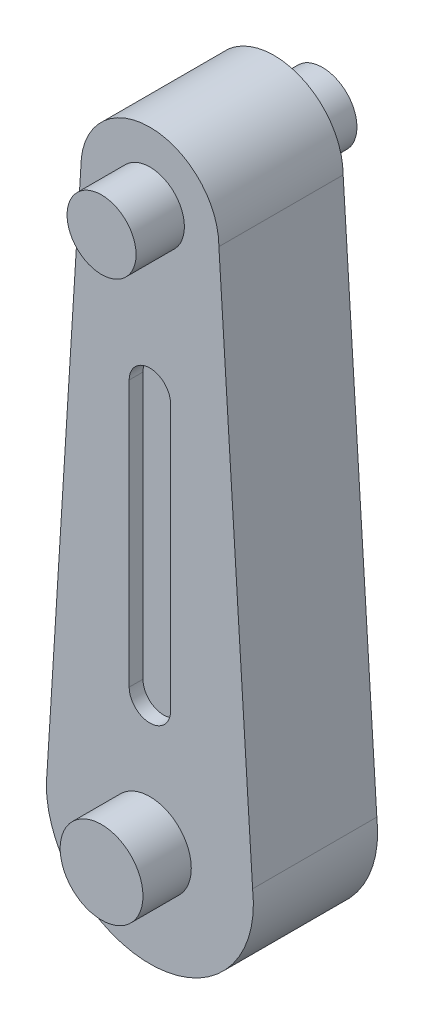
ISO-10303-21;
HEADER;
FILE_DESCRIPTION(('STEP AP214'),'2;1');
FILE_NAME('part.step','',(''),(''),'','','');
FILE_SCHEMA(('AUTOMOTIVE_DESIGN { 1 0 10303 214 1 1 1 1 }'));
ENDSEC;
DATA;
#1=APPLICATION_CONTEXT('core data for automotive mechanical design processes');
#2=APPLICATION_PROTOCOL_DEFINITION('international standard','automotive_design',2000,#1);
#3=PRODUCT_CONTEXT('',#1,'mechanical');
#4=PRODUCT('Part','Part','',(#3));
#5=PRODUCT_RELATED_PRODUCT_CATEGORY('part','',(#4));
#6=PRODUCT_DEFINITION_FORMATION('','',#4);
#7=PRODUCT_DEFINITION_CONTEXT('part definition',#1,'design');
#8=PRODUCT_DEFINITION('design','',#6,#7);
#9=PRODUCT_DEFINITION_SHAPE('','',#8);
#10=(LENGTH_UNIT() NAMED_UNIT(*) SI_UNIT(.MILLI.,.METRE.));
#11=(NAMED_UNIT(*) PLANE_ANGLE_UNIT() SI_UNIT($,.RADIAN.));
#12=(NAMED_UNIT(*) SI_UNIT($,.STERADIAN.) SOLID_ANGLE_UNIT());
#13=UNCERTAINTY_MEASURE_WITH_UNIT(LENGTH_MEASURE(1.E-05),#10,'distance_accuracy_value','');
#14=(GEOMETRIC_REPRESENTATION_CONTEXT(3) GLOBAL_UNCERTAINTY_ASSIGNED_CONTEXT((#13)) GLOBAL_UNIT_ASSIGNED_CONTEXT((#10,
#11,#12)) REPRESENTATION_CONTEXT('',''));
#15=CARTESIAN_POINT('',(0.,0.,0.));
#16=DIRECTION('',(0.,0.,1.));
#17=DIRECTION('',(1.,0.,0.));
#18=AXIS2_PLACEMENT_3D('',#15,#16,#17);
#19=CARTESIAN_POINT('',(0.,-187.5,-45.));
#20=DIRECTION('',(0.,0.,1.));
#21=DIRECTION('',(1.,0.,0.));
#22=AXIS2_PLACEMENT_3D('',#19,#20,#21);
#23=PLANE('',#22);
#24=CARTESIAN_POINT('',(0.,-187.5,-45.));
#25=DIRECTION('',(0.,0.,1.));
#26=DIRECTION('',(1.,0.,0.));
#27=AXIS2_PLACEMENT_3D('',#24,#25,#26);
#28=CIRCLE('',#27,75.);
#29=CARTESIAN_POINT('',(-74.4163424124514,-178.161478599222,-45.));
#30=VERTEX_POINT('',#29);
#31=CARTESIAN_POINT('',(74.4163424124514,-178.161478599222,-45.));
#32=VERTEX_POINT('',#31);
#33=EDGE_CURVE('E254',#30,#32,#28,.T.);
#34=ORIENTED_EDGE('',*,*,#33,.F.);
#35=DIRECTION('',(-0.0623782861551805,-0.998052578482888,0.));
#36=VECTOR('',#35,1.);
#37=CARTESIAN_POINT('',(-50.,212.5,-45.));
#38=LINE('',#37,#36);
#39=CARTESIAN_POINT('',(-50.,212.5,-45.));
#40=VERTEX_POINT('',#39);
#41=EDGE_CURVE('E263',#40,#30,#38,.T.);
#42=ORIENTED_EDGE('',*,*,#41,.F.);
#43=CARTESIAN_POINT('',(0.,212.5,-45.));
#44=DIRECTION('',(0.,0.,1.));
#45=DIRECTION('',(1.,0.,0.));
#46=AXIS2_PLACEMENT_3D('',#43,#44,#45);
#47=CIRCLE('',#46,50.);
#48=CARTESIAN_POINT('',(50.,212.5,-45.));
#49=VERTEX_POINT('',#48);
#50=EDGE_CURVE('E279',#49,#40,#47,.T.);
#51=ORIENTED_EDGE('',*,*,#50,.F.);
#52=DIRECTION('',(-0.0623782861551805,0.998052578482888,0.));
#53=VECTOR('',#52,1.);
#54=CARTESIAN_POINT('',(50.,212.5,-45.));
#55=LINE('',#54,#53);
#56=EDGE_CURVE('E276',#32,#49,#55,.T.);
#57=ORIENTED_EDGE('',*,*,#56,.F.);
#58=EDGE_LOOP('',(#34,#42,#51,#57));
#59=FACE_BOUND('',#58,.T.);
#60=CARTESIAN_POINT('',(0.,212.5,-45.));
#61=DIRECTION('',(0.,0.,1.));
#62=DIRECTION('',(1.,0.,0.));
#63=AXIS2_PLACEMENT_3D('',#60,#61,#62);
#64=CIRCLE('',#63,25.);
#65=CARTESIAN_POINT('',(25.,212.5,-45.));
#66=VERTEX_POINT('',#65);
#67=EDGE_CURVE('E230',#66,#66,#64,.T.);
#68=ORIENTED_EDGE('',*,*,#67,.T.);
#69=EDGE_LOOP('',(#68));
#70=FACE_BOUND('',#69,.T.);
#71=CARTESIAN_POINT('',(0.,-187.5,-45.));
#72=DIRECTION('',(0.,0.,1.));
#73=DIRECTION('',(1.,0.,0.));
#74=AXIS2_PLACEMENT_3D('',#71,#72,#73);
#75=CIRCLE('',#74,30.);
#76=CARTESIAN_POINT('',(30.,-187.5,-45.));
#77=VERTEX_POINT('',#76);
#78=EDGE_CURVE('E217',#77,#77,#75,.T.);
#79=ORIENTED_EDGE('',*,*,#78,.T.);
#80=EDGE_LOOP('',(#79));
#81=FACE_BOUND('',#80,.T.);
#82=CARTESIAN_POINT('',(0.,96.3528283139753,-45.));
#83=DIRECTION('',(0.,0.,1.));
#84=DIRECTION('',(1.,0.,0.));
#85=AXIS2_PLACEMENT_3D('',#82,#83,#84);
#86=CIRCLE('',#85,15.);
#87=CARTESIAN_POINT('',(14.9999999999999,96.3528283139753,-45.));
#88=VERTEX_POINT('',#87);
#89=CARTESIAN_POINT('',(-15.,96.3528283139753,-45.));
#90=VERTEX_POINT('',#89);
#91=EDGE_CURVE('E59',#88,#90,#86,.T.);
#92=ORIENTED_EDGE('',*,*,#91,.T.);
#93=DIRECTION('',(0.,-1.,0.));
#94=VECTOR('',#93,1.);
#95=CARTESIAN_POINT('',(-15.,96.3528283139753,-45.));
#96=LINE('',#95,#94);
#97=CARTESIAN_POINT('',(-15.,-96.3528283139753,-45.));
#98=VERTEX_POINT('',#97);
#99=EDGE_CURVE('E156',#90,#98,#96,.T.);
#100=ORIENTED_EDGE('',*,*,#99,.T.);
#101=CARTESIAN_POINT('',(0.,-96.3528283139753,-45.));
#102=DIRECTION('',(0.,0.,1.));
#103=DIRECTION('',(1.,0.,0.));
#104=AXIS2_PLACEMENT_3D('',#101,#102,#103);
#105=CIRCLE('',#104,15.);
#106=CARTESIAN_POINT('',(15.,-96.3528283139753,-45.));
#107=VERTEX_POINT('',#106);
#108=EDGE_CURVE('E160',#98,#107,#105,.T.);
#109=ORIENTED_EDGE('',*,*,#108,.T.);
#110=DIRECTION('',(0.,1.,0.));
#111=VECTOR('',#110,1.);
#112=CARTESIAN_POINT('',(14.9999999999999,96.3528283139753,-45.));
#113=LINE('',#112,#111);
#114=EDGE_CURVE('E169',#107,#88,#113,.T.);
#115=ORIENTED_EDGE('',*,*,#114,.T.);
#116=EDGE_LOOP('',(#92,#100,#109,#115));
#117=FACE_BOUND('',#116,.T.);
#118=ADVANCED_FACE('F43',(#59,#70,#81,#117),#23,.F.);
#119=CARTESIAN_POINT('',(0.,-187.5,45.));
#120=DIRECTION('',(0.,0.,-1.));
#121=DIRECTION('',(-1.,0.,0.));
#122=AXIS2_PLACEMENT_3D('',#119,#120,#121);
#123=CYLINDRICAL_SURFACE('',#122,75.);
#124=ORIENTED_EDGE('',*,*,#33,.T.);
#125=DIRECTION('',(0.,0.,-1.));
#126=VECTOR('',#125,1.);
#127=CARTESIAN_POINT('',(74.4163424124514,-178.161478599222,45.));
#128=LINE('',#127,#126);
#129=CARTESIAN_POINT('',(74.4163424124514,-178.161478599222,45.));
#130=VERTEX_POINT('',#129);
#131=EDGE_CURVE('E11',#130,#32,#128,.T.);
#132=ORIENTED_EDGE('',*,*,#131,.F.);
#133=CARTESIAN_POINT('',(0.,-187.5,45.));
#134=DIRECTION('',(0.,0.,1.));
#135=DIRECTION('',(1.,0.,0.));
#136=AXIS2_PLACEMENT_3D('',#133,#134,#135);
#137=CIRCLE('',#136,75.);
#138=CARTESIAN_POINT('',(-74.4163424124514,-178.161478599222,45.));
#139=VERTEX_POINT('',#138);
#140=EDGE_CURVE('E258',#139,#130,#137,.T.);
#141=ORIENTED_EDGE('',*,*,#140,.F.);
#142=DIRECTION('',(0.,0.,-1.));
#143=VECTOR('',#142,1.);
#144=CARTESIAN_POINT('',(-74.4163424124514,-178.161478599222,45.));
#145=LINE('',#144,#143);
#146=EDGE_CURVE('E272',#139,#30,#145,.T.);
#147=ORIENTED_EDGE('',*,*,#146,.T.);
#148=EDGE_LOOP('',(#124,#132,#141,#147));
#149=FACE_BOUND('',#148,.T.);
#150=ADVANCED_FACE('F45',(#149),#123,.T.);
#151=CARTESIAN_POINT('',(50.,212.5,45.));
#152=DIRECTION('',(-0.998052578482888,-0.0623782861551805,0.));
#153=DIRECTION('',(0.0623782861551805,-0.998052578482889,0.));
#154=AXIS2_PLACEMENT_3D('',#151,#152,#153);
#155=PLANE('',#154);
#156=ORIENTED_EDGE('',*,*,#56,.T.);
#157=DIRECTION('',(0.,0.,-1.));
#158=VECTOR('',#157,1.);
#159=CARTESIAN_POINT('',(50.,212.5,45.));
#160=LINE('',#159,#158);
#161=CARTESIAN_POINT('',(50.,212.5,45.));
#162=VERTEX_POINT('',#161);
#163=EDGE_CURVE('E52',#162,#49,#160,.T.);
#164=ORIENTED_EDGE('',*,*,#163,.F.);
#165=DIRECTION('',(-0.0623782861551805,0.998052578482888,0.));
#166=VECTOR('',#165,1.);
#167=CARTESIAN_POINT('',(50.,212.5,45.));
#168=LINE('',#167,#166);
#169=EDGE_CURVE('E262',#130,#162,#168,.T.);
#170=ORIENTED_EDGE('',*,*,#169,.F.);
#171=ORIENTED_EDGE('',*,*,#131,.T.);
#172=EDGE_LOOP('',(#156,#164,#170,#171));
#173=FACE_BOUND('',#172,.T.);
#174=ADVANCED_FACE('F312',(#173),#155,.F.);
#175=CARTESIAN_POINT('',(0.,212.5,45.));
#176=DIRECTION('',(0.,0.,-1.));
#177=DIRECTION('',(-1.,0.,0.));
#178=AXIS2_PLACEMENT_3D('',#175,#176,#177);
#179=CYLINDRICAL_SURFACE('',#178,50.);
#180=ORIENTED_EDGE('',*,*,#50,.T.);
#181=DIRECTION('',(0.,0.,-1.));
#182=VECTOR('',#181,1.);
#183=CARTESIAN_POINT('',(-50.,212.5,45.));
#184=LINE('',#183,#182);
#185=CARTESIAN_POINT('',(-50.,212.5,45.));
#186=VERTEX_POINT('',#185);
#187=EDGE_CURVE('E287',#186,#40,#184,.T.);
#188=ORIENTED_EDGE('',*,*,#187,.F.);
#189=CARTESIAN_POINT('',(0.,212.5,45.));
#190=DIRECTION('',(0.,0.,1.));
#191=DIRECTION('',(1.,0.,0.));
#192=AXIS2_PLACEMENT_3D('',#189,#190,#191);
#193=CIRCLE('',#192,50.);
#194=EDGE_CURVE('E266',#162,#186,#193,.T.);
#195=ORIENTED_EDGE('',*,*,#194,.F.);
#196=ORIENTED_EDGE('',*,*,#163,.T.);
#197=EDGE_LOOP('',(#180,#188,#195,#196));
#198=FACE_BOUND('',#197,.T.);
#199=ADVANCED_FACE('F296',(#198),#179,.T.);
#200=CARTESIAN_POINT('',(-50.,212.5,45.));
#201=DIRECTION('',(0.998052578482888,-0.0623782861551805,0.));
#202=DIRECTION('',(0.0623782861551805,0.998052578482889,0.));
#203=AXIS2_PLACEMENT_3D('',#200,#201,#202);
#204=PLANE('',#203);
#205=ORIENTED_EDGE('',*,*,#41,.T.);
#206=ORIENTED_EDGE('',*,*,#146,.F.);
#207=DIRECTION('',(-0.0623782861551805,-0.998052578482888,0.));
#208=VECTOR('',#207,1.);
#209=CARTESIAN_POINT('',(-50.,212.5,45.));
#210=LINE('',#209,#208);
#211=EDGE_CURVE('E269',#186,#139,#210,.T.);
#212=ORIENTED_EDGE('',*,*,#211,.F.);
#213=ORIENTED_EDGE('',*,*,#187,.T.);
#214=EDGE_LOOP('',(#205,#206,#212,#213));
#215=FACE_BOUND('',#214,.T.);
#216=ADVANCED_FACE('F305',(#215),#204,.F.);
#217=CARTESIAN_POINT('',(0.,-187.5,45.));
#218=DIRECTION('',(0.,0.,1.));
#219=DIRECTION('',(1.,0.,0.));
#220=AXIS2_PLACEMENT_3D('',#217,#218,#219);
#221=PLANE('',#220);
#222=CARTESIAN_POINT('',(0.,96.3528283139753,45.));
#223=DIRECTION('',(0.,0.,1.));
#224=DIRECTION('',(1.,0.,0.));
#225=AXIS2_PLACEMENT_3D('',#222,#223,#224);
#226=CIRCLE('',#225,15.);
#227=CARTESIAN_POINT('',(14.9999999999999,96.3528283139753,45.));
#228=VERTEX_POINT('',#227);
#229=CARTESIAN_POINT('',(-15.,96.3528283139753,45.));
#230=VERTEX_POINT('',#229);
#231=EDGE_CURVE('E67',#228,#230,#226,.T.);
#232=ORIENTED_EDGE('',*,*,#231,.F.);
#233=DIRECTION('',(0.,1.,0.));
#234=VECTOR('',#233,1.);
#235=CARTESIAN_POINT('',(14.9999999999999,96.3528283139753,45.));
#236=LINE('',#235,#234);
#237=CARTESIAN_POINT('',(15.,-96.3528283139753,45.));
#238=VERTEX_POINT('',#237);
#239=EDGE_CURVE('E188',#238,#228,#236,.T.);
#240=ORIENTED_EDGE('',*,*,#239,.F.);
#241=CARTESIAN_POINT('',(0.,-96.3528283139753,45.));
#242=DIRECTION('',(0.,0.,1.));
#243=DIRECTION('',(1.,0.,0.));
#244=AXIS2_PLACEMENT_3D('',#241,#242,#243);
#245=CIRCLE('',#244,15.);
#246=CARTESIAN_POINT('',(-15.,-96.3528283139753,45.));
#247=VERTEX_POINT('',#246);
#248=EDGE_CURVE('E207',#247,#238,#245,.T.);
#249=ORIENTED_EDGE('',*,*,#248,.F.);
#250=DIRECTION('',(0.,-1.,0.));
#251=VECTOR('',#250,1.);
#252=CARTESIAN_POINT('',(-15.,96.3528283139753,45.));
#253=LINE('',#252,#251);
#254=EDGE_CURVE('E203',#230,#247,#253,.T.);
#255=ORIENTED_EDGE('',*,*,#254,.F.);
#256=EDGE_LOOP('',(#232,#240,#249,#255));
#257=FACE_BOUND('',#256,.T.);
#258=CARTESIAN_POINT('',(0.,-187.5,45.));
#259=DIRECTION('',(0.,0.,1.));
#260=DIRECTION('',(1.,0.,0.));
#261=AXIS2_PLACEMENT_3D('',#258,#259,#260);
#262=CIRCLE('',#261,30.);
#263=CARTESIAN_POINT('',(30.,-187.5,45.));
#264=VERTEX_POINT('',#263);
#265=EDGE_CURVE('E242',#264,#264,#262,.T.);
#266=ORIENTED_EDGE('',*,*,#265,.F.);
#267=EDGE_LOOP('',(#266));
#268=FACE_BOUND('',#267,.T.);
#269=CARTESIAN_POINT('',(0.,212.5,45.));
#270=DIRECTION('',(0.,0.,1.));
#271=DIRECTION('',(1.,0.,0.));
#272=AXIS2_PLACEMENT_3D('',#269,#270,#271);
#273=CIRCLE('',#272,25.);
#274=CARTESIAN_POINT('',(25.,212.5,45.));
#275=VERTEX_POINT('',#274);
#276=EDGE_CURVE('E246',#275,#275,#273,.T.);
#277=ORIENTED_EDGE('',*,*,#276,.F.);
#278=EDGE_LOOP('',(#277));
#279=FACE_BOUND('',#278,.T.);
#280=ORIENTED_EDGE('',*,*,#140,.T.);
#281=ORIENTED_EDGE('',*,*,#169,.T.);
#282=ORIENTED_EDGE('',*,*,#194,.T.);
#283=ORIENTED_EDGE('',*,*,#211,.T.);
#284=EDGE_LOOP('',(#280,#281,#282,#283));
#285=FACE_BOUND('',#284,.T.);
#286=ADVANCED_FACE('F311',(#257,#268,#279,#285),#221,.T.);
#287=CARTESIAN_POINT('',(0.,212.5,80.));
#288=DIRECTION('',(0.,0.,-1.));
#289=DIRECTION('',(-1.,0.,0.));
#290=AXIS2_PLACEMENT_3D('',#287,#288,#289);
#291=CYLINDRICAL_SURFACE('',#290,25.);
#292=CARTESIAN_POINT('',(0.,212.5,80.));
#293=DIRECTION('',(0.,0.,1.));
#294=DIRECTION('',(1.,0.,0.));
#295=AXIS2_PLACEMENT_3D('',#292,#293,#294);
#296=CIRCLE('',#295,25.);
#297=CARTESIAN_POINT('',(25.,212.5,80.));
#298=VERTEX_POINT('',#297);
#299=EDGE_CURVE('E250',#298,#298,#296,.T.);
#300=ORIENTED_EDGE('',*,*,#299,.F.);
#301=EDGE_LOOP('',(#300));
#302=FACE_BOUND('',#301,.T.);
#303=ORIENTED_EDGE('',*,*,#276,.T.);
#304=EDGE_LOOP('',(#303));
#305=FACE_BOUND('',#304,.T.);
#306=ADVANCED_FACE('F330',(#302,#305),#291,.T.);
#307=CARTESIAN_POINT('',(0.,212.5,80.));
#308=DIRECTION('',(0.,0.,1.));
#309=DIRECTION('',(1.,0.,0.));
#310=AXIS2_PLACEMENT_3D('',#307,#308,#309);
#311=PLANE('',#310);
#312=ORIENTED_EDGE('',*,*,#299,.T.);
#313=EDGE_LOOP('',(#312));
#314=FACE_BOUND('',#313,.T.);
#315=ADVANCED_FACE('F335',(#314),#311,.T.);
#316=CARTESIAN_POINT('',(0.,-187.5,80.));
#317=DIRECTION('',(0.,0.,-1.));
#318=DIRECTION('',(-1.,0.,0.));
#319=AXIS2_PLACEMENT_3D('',#316,#317,#318);
#320=CYLINDRICAL_SURFACE('',#319,30.);
#321=CARTESIAN_POINT('',(0.,-187.5,80.));
#322=DIRECTION('',(0.,0.,1.));
#323=DIRECTION('',(1.,0.,0.));
#324=AXIS2_PLACEMENT_3D('',#321,#322,#323);
#325=CIRCLE('',#324,30.);
#326=CARTESIAN_POINT('',(30.,-187.5,80.));
#327=VERTEX_POINT('',#326);
#328=EDGE_CURVE('E238',#327,#327,#325,.T.);
#329=ORIENTED_EDGE('',*,*,#328,.F.);
#330=EDGE_LOOP('',(#329));
#331=FACE_BOUND('',#330,.T.);
#332=ORIENTED_EDGE('',*,*,#265,.T.);
#333=EDGE_LOOP('',(#332));
#334=FACE_BOUND('',#333,.T.);
#335=ADVANCED_FACE('F345',(#331,#334),#320,.T.);
#336=CARTESIAN_POINT('',(0.,-187.5,80.));
#337=DIRECTION('',(0.,0.,1.));
#338=DIRECTION('',(1.,0.,0.));
#339=AXIS2_PLACEMENT_3D('',#336,#337,#338);
#340=PLANE('',#339);
#341=ORIENTED_EDGE('',*,*,#328,.T.);
#342=EDGE_LOOP('',(#341));
#343=FACE_BOUND('',#342,.T.);
#344=ADVANCED_FACE('F347',(#343),#340,.T.);
#345=CARTESIAN_POINT('',(0.,212.5,-80.));
#346=DIRECTION('',(0.,0.,1.));
#347=DIRECTION('',(1.,0.,0.));
#348=AXIS2_PLACEMENT_3D('',#345,#346,#347);
#349=CYLINDRICAL_SURFACE('',#348,25.);
#350=CARTESIAN_POINT('',(0.,212.5,-80.));
#351=DIRECTION('',(0.,0.,1.));
#352=DIRECTION('',(1.,0.,0.));
#353=AXIS2_PLACEMENT_3D('',#350,#351,#352);
#354=CIRCLE('',#353,25.);
#355=CARTESIAN_POINT('',(25.,212.5,-80.));
#356=VERTEX_POINT('',#355);
#357=EDGE_CURVE('E234',#356,#356,#354,.T.);
#358=ORIENTED_EDGE('',*,*,#357,.T.);
#359=EDGE_LOOP('',(#358));
#360=FACE_BOUND('',#359,.T.);
#361=ORIENTED_EDGE('',*,*,#67,.F.);
#362=EDGE_LOOP('',(#361));
#363=FACE_BOUND('',#362,.T.);
#364=ADVANCED_FACE('F354',(#360,#363),#349,.T.);
#365=CARTESIAN_POINT('',(0.,212.5,-80.));
#366=DIRECTION('',(0.,0.,-1.));
#367=DIRECTION('',(1.,0.,0.));
#368=AXIS2_PLACEMENT_3D('',#365,#366,#367);
#369=PLANE('',#368);
#370=ORIENTED_EDGE('',*,*,#357,.F.);
#371=EDGE_LOOP('',(#370));
#372=FACE_BOUND('',#371,.T.);
#373=ADVANCED_FACE('F363',(#372),#369,.T.);
#374=CARTESIAN_POINT('',(0.,-187.5,-80.));
#375=DIRECTION('',(0.,0.,1.));
#376=DIRECTION('',(1.,0.,0.));
#377=AXIS2_PLACEMENT_3D('',#374,#375,#376);
#378=CYLINDRICAL_SURFACE('',#377,30.);
#379=CARTESIAN_POINT('',(0.,-187.5,-80.));
#380=DIRECTION('',(0.,0.,1.));
#381=DIRECTION('',(1.,0.,0.));
#382=AXIS2_PLACEMENT_3D('',#379,#380,#381);
#383=CIRCLE('',#382,30.);
#384=CARTESIAN_POINT('',(30.,-187.5,-80.));
#385=VERTEX_POINT('',#384);
#386=EDGE_CURVE('E226',#385,#385,#383,.T.);
#387=ORIENTED_EDGE('',*,*,#386,.T.);
#388=EDGE_LOOP('',(#387));
#389=FACE_BOUND('',#388,.T.);
#390=ORIENTED_EDGE('',*,*,#78,.F.);
#391=EDGE_LOOP('',(#390));
#392=FACE_BOUND('',#391,.T.);
#393=ADVANCED_FACE('F367',(#389,#392),#378,.T.);
#394=CARTESIAN_POINT('',(0.,-187.5,-80.));
#395=DIRECTION('',(0.,0.,-1.));
#396=DIRECTION('',(1.,0.,0.));
#397=AXIS2_PLACEMENT_3D('',#394,#395,#396);
#398=PLANE('',#397);
#399=ORIENTED_EDGE('',*,*,#386,.F.);
#400=EDGE_LOOP('',(#399));
#401=FACE_BOUND('',#400,.T.);
#402=ADVANCED_FACE('F371',(#401),#398,.T.);
#403=CARTESIAN_POINT('',(0.,96.3528283139753,35.));
#404=DIRECTION('',(0.,0.,1.));
#405=DIRECTION('',(1.,0.,0.));
#406=AXIS2_PLACEMENT_3D('',#403,#404,#405);
#407=CYLINDRICAL_SURFACE('',#406,15.);
#408=ORIENTED_EDGE('',*,*,#231,.T.);
#409=DIRECTION('',(0.,0.,1.));
#410=VECTOR('',#409,1.);
#411=CARTESIAN_POINT('',(-15.,96.3528283139753,35.));
#412=LINE('',#411,#410);
#413=CARTESIAN_POINT('',(-15.,96.3528283139753,35.));
#414=VERTEX_POINT('',#413);
#415=EDGE_CURVE('E200',#414,#230,#412,.T.);
#416=ORIENTED_EDGE('',*,*,#415,.F.);
#417=CARTESIAN_POINT('',(0.,96.3528283139753,35.));
#418=DIRECTION('',(0.,0.,1.));
#419=DIRECTION('',(1.,0.,0.));
#420=AXIS2_PLACEMENT_3D('',#417,#418,#419);
#421=CIRCLE('',#420,15.);
#422=CARTESIAN_POINT('',(14.9999999999999,96.3528283139753,35.));
#423=VERTEX_POINT('',#422);
#424=EDGE_CURVE('E183',#423,#414,#421,.T.);
#425=ORIENTED_EDGE('',*,*,#424,.F.);
#426=DIRECTION('',(0.,0.,1.));
#427=VECTOR('',#426,1.);
#428=CARTESIAN_POINT('',(14.9999999999999,96.3528283139753,35.));
#429=LINE('',#428,#427);
#430=EDGE_CURVE('E214',#423,#228,#429,.T.);
#431=ORIENTED_EDGE('',*,*,#430,.T.);
#432=EDGE_LOOP('',(#408,#416,#425,#431));
#433=FACE_BOUND('',#432,.T.);
#434=ADVANCED_FACE('F375',(#433),#407,.F.);
#435=CARTESIAN_POINT('',(14.9999999999999,96.3528283139753,35.));
#436=DIRECTION('',(1.,0.,0.));
#437=DIRECTION('',(0.,1.,0.));
#438=AXIS2_PLACEMENT_3D('',#435,#436,#437);
#439=PLANE('',#438);
#440=ORIENTED_EDGE('',*,*,#239,.T.);
#441=ORIENTED_EDGE('',*,*,#430,.F.);
#442=DIRECTION('',(0.,1.,0.));
#443=VECTOR('',#442,1.);
#444=CARTESIAN_POINT('',(14.9999999999999,96.3528283139753,35.));
#445=LINE('',#444,#443);
#446=CARTESIAN_POINT('',(15.,-96.3528283139753,35.));
#447=VERTEX_POINT('',#446);
#448=EDGE_CURVE('E196',#447,#423,#445,.T.);
#449=ORIENTED_EDGE('',*,*,#448,.F.);
#450=DIRECTION('',(0.,0.,1.));
#451=VECTOR('',#450,1.);
#452=CARTESIAN_POINT('',(15.,-96.3528283139753,35.));
#453=LINE('',#452,#451);
#454=EDGE_CURVE('E218',#447,#238,#453,.T.);
#455=ORIENTED_EDGE('',*,*,#454,.T.);
#456=EDGE_LOOP('',(#440,#441,#449,#455));
#457=FACE_BOUND('',#456,.T.);
#458=ADVANCED_FACE('F379',(#457),#439,.F.);
#459=CARTESIAN_POINT('',(0.,-96.3528283139753,35.));
#460=DIRECTION('',(0.,0.,1.));
#461=DIRECTION('',(1.,0.,0.));
#462=AXIS2_PLACEMENT_3D('',#459,#460,#461);
#463=CYLINDRICAL_SURFACE('',#462,15.);
#464=ORIENTED_EDGE('',*,*,#248,.T.);
#465=ORIENTED_EDGE('',*,*,#454,.F.);
#466=CARTESIAN_POINT('',(0.,-96.3528283139753,35.));
#467=DIRECTION('',(0.,0.,1.));
#468=DIRECTION('',(1.,0.,0.));
#469=AXIS2_PLACEMENT_3D('',#466,#467,#468);
#470=CIRCLE('',#469,15.);
#471=CARTESIAN_POINT('',(-15.,-96.3528283139753,35.));
#472=VERTEX_POINT('',#471);
#473=EDGE_CURVE('E192',#472,#447,#470,.T.);
#474=ORIENTED_EDGE('',*,*,#473,.F.);
#475=DIRECTION('',(0.,0.,1.));
#476=VECTOR('',#475,1.);
#477=CARTESIAN_POINT('',(-15.,-96.3528283139753,35.));
#478=LINE('',#477,#476);
#479=EDGE_CURVE('E221',#472,#247,#478,.T.);
#480=ORIENTED_EDGE('',*,*,#479,.T.);
#481=EDGE_LOOP('',(#464,#465,#474,#480));
#482=FACE_BOUND('',#481,.T.);
#483=ADVANCED_FACE('F384',(#482),#463,.F.);
#484=CARTESIAN_POINT('',(-15.,96.3528283139753,35.));
#485=DIRECTION('',(-1.,0.,0.));
#486=DIRECTION('',(0.,-1.,0.));
#487=AXIS2_PLACEMENT_3D('',#484,#485,#486);
#488=PLANE('',#487);
#489=ORIENTED_EDGE('',*,*,#254,.T.);
#490=ORIENTED_EDGE('',*,*,#479,.F.);
#491=DIRECTION('',(0.,-1.,0.));
#492=VECTOR('',#491,1.);
#493=CARTESIAN_POINT('',(-15.,96.3528283139753,35.));
#494=LINE('',#493,#492);
#495=EDGE_CURVE('E187',#414,#472,#494,.T.);
#496=ORIENTED_EDGE('',*,*,#495,.F.);
#497=ORIENTED_EDGE('',*,*,#415,.T.);
#498=EDGE_LOOP('',(#489,#490,#496,#497));
#499=FACE_BOUND('',#498,.T.);
#500=ADVANCED_FACE('F380',(#499),#488,.F.);
#501=CARTESIAN_POINT('',(0.,96.3528283139753,35.));
#502=DIRECTION('',(0.,0.,1.));
#503=DIRECTION('',(1.,0.,0.));
#504=AXIS2_PLACEMENT_3D('',#501,#502,#503);
#505=PLANE('',#504);
#506=ORIENTED_EDGE('',*,*,#424,.T.);
#507=ORIENTED_EDGE('',*,*,#495,.T.);
#508=ORIENTED_EDGE('',*,*,#473,.T.);
#509=ORIENTED_EDGE('',*,*,#448,.T.);
#510=EDGE_LOOP('',(#506,#507,#508,#509));
#511=FACE_BOUND('',#510,.T.);
#512=ADVANCED_FACE('F383',(#511),#505,.T.);
#513=CARTESIAN_POINT('',(0.,96.3528283139753,-35.));
#514=DIRECTION('',(0.,0.,-1.));
#515=DIRECTION('',(-1.,0.,0.));
#516=AXIS2_PLACEMENT_3D('',#513,#514,#515);
#517=CYLINDRICAL_SURFACE('',#516,15.);
#518=ORIENTED_EDGE('',*,*,#91,.F.);
#519=DIRECTION('',(0.,0.,-1.));
#520=VECTOR('',#519,1.);
#521=CARTESIAN_POINT('',(14.9999999999999,96.3528283139753,-35.));
#522=LINE('',#521,#520);
#523=CARTESIAN_POINT('',(14.9999999999999,96.3528283139753,-35.));
#524=VERTEX_POINT('',#523);
#525=EDGE_CURVE('E138',#524,#88,#522,.T.);
#526=ORIENTED_EDGE('',*,*,#525,.F.);
#527=CARTESIAN_POINT('',(0.,96.3528283139753,-35.));
#528=DIRECTION('',(0.,0.,1.));
#529=DIRECTION('',(1.,0.,0.));
#530=AXIS2_PLACEMENT_3D('',#527,#528,#529);
#531=CIRCLE('',#530,15.);
#532=CARTESIAN_POINT('',(-15.,96.3528283139753,-35.));
#533=VERTEX_POINT('',#532);
#534=EDGE_CURVE('E146',#524,#533,#531,.T.);
#535=ORIENTED_EDGE('',*,*,#534,.T.);
#536=DIRECTION('',(0.,0.,-1.));
#537=VECTOR('',#536,1.);
#538=CARTESIAN_POINT('',(-15.,96.3528283139753,-35.));
#539=LINE('',#538,#537);
#540=EDGE_CURVE('E175',#533,#90,#539,.T.);
#541=ORIENTED_EDGE('',*,*,#540,.T.);
#542=EDGE_LOOP('',(#518,#526,#535,#541));
#543=FACE_BOUND('',#542,.T.);
#544=ADVANCED_FACE('F149',(#543),#517,.F.);
#545=CARTESIAN_POINT('',(-15.,96.3528283139753,-35.));
#546=DIRECTION('',(1.,0.,0.));
#547=DIRECTION('',(0.,1.,0.));
#548=AXIS2_PLACEMENT_3D('',#545,#546,#547);
#549=PLANE('',#548);
#550=ORIENTED_EDGE('',*,*,#99,.F.);
#551=ORIENTED_EDGE('',*,*,#540,.F.);
#552=DIRECTION('',(0.,-1.,0.));
#553=VECTOR('',#552,1.);
#554=CARTESIAN_POINT('',(-15.,96.3528283139753,-35.));
#555=LINE('',#554,#553);
#556=CARTESIAN_POINT('',(-15.,-96.3528283139753,-35.));
#557=VERTEX_POINT('',#556);
#558=EDGE_CURVE('E152',#533,#557,#555,.T.);
#559=ORIENTED_EDGE('',*,*,#558,.T.);
#560=DIRECTION('',(0.,0.,-1.));
#561=VECTOR('',#560,1.);
#562=CARTESIAN_POINT('',(-15.,-96.3528283139753,-35.));
#563=LINE('',#562,#561);
#564=EDGE_CURVE('E178',#557,#98,#563,.T.);
#565=ORIENTED_EDGE('',*,*,#564,.T.);
#566=EDGE_LOOP('',(#550,#551,#559,#565));
#567=FACE_BOUND('',#566,.T.);
#568=ADVANCED_FACE('F397',(#567),#549,.T.);
#569=CARTESIAN_POINT('',(0.,-96.3528283139753,-35.));
#570=DIRECTION('',(0.,0.,-1.));
#571=DIRECTION('',(-1.,0.,0.));
#572=AXIS2_PLACEMENT_3D('',#569,#570,#571);
#573=CYLINDRICAL_SURFACE('',#572,15.);
#574=ORIENTED_EDGE('',*,*,#108,.F.);
#575=ORIENTED_EDGE('',*,*,#564,.F.);
#576=CARTESIAN_POINT('',(0.,-96.3528283139753,-35.));
#577=DIRECTION('',(0.,0.,1.));
#578=DIRECTION('',(1.,0.,0.));
#579=AXIS2_PLACEMENT_3D('',#576,#577,#578);
#580=CIRCLE('',#579,15.);
#581=CARTESIAN_POINT('',(15.,-96.3528283139753,-35.));
#582=VERTEX_POINT('',#581);
#583=EDGE_CURVE('E145',#557,#582,#580,.T.);
#584=ORIENTED_EDGE('',*,*,#583,.T.);
#585=DIRECTION('',(0.,0.,-1.));
#586=VECTOR('',#585,1.);
#587=CARTESIAN_POINT('',(15.,-96.3528283139753,-35.));
#588=LINE('',#587,#586);
#589=EDGE_CURVE('E140',#582,#107,#588,.T.);
#590=ORIENTED_EDGE('',*,*,#589,.T.);
#591=EDGE_LOOP('',(#574,#575,#584,#590));
#592=FACE_BOUND('',#591,.T.);
#593=ADVANCED_FACE('F400',(#592),#573,.F.);
#594=CARTESIAN_POINT('',(14.9999999999999,96.3528283139753,-35.));
#595=DIRECTION('',(-1.,0.,0.));
#596=DIRECTION('',(0.,-1.,0.));
#597=AXIS2_PLACEMENT_3D('',#594,#595,#596);
#598=PLANE('',#597);
#599=ORIENTED_EDGE('',*,*,#114,.F.);
#600=ORIENTED_EDGE('',*,*,#589,.F.);
#601=DIRECTION('',(0.,1.,0.));
#602=VECTOR('',#601,1.);
#603=CARTESIAN_POINT('',(14.9999999999999,96.3528283139753,-35.));
#604=LINE('',#603,#602);
#605=EDGE_CURVE('E135',#582,#524,#604,.T.);
#606=ORIENTED_EDGE('',*,*,#605,.T.);
#607=ORIENTED_EDGE('',*,*,#525,.T.);
#608=EDGE_LOOP('',(#599,#600,#606,#607));
#609=FACE_BOUND('',#608,.T.);
#610=ADVANCED_FACE('F137',(#609),#598,.T.);
#611=CARTESIAN_POINT('',(0.,96.3528283139753,-35.));
#612=DIRECTION('',(0.,0.,-1.));
#613=DIRECTION('',(1.,0.,0.));
#614=AXIS2_PLACEMENT_3D('',#611,#612,#613);
#615=PLANE('',#614);
#616=ORIENTED_EDGE('',*,*,#534,.F.);
#617=ORIENTED_EDGE('',*,*,#605,.F.);
#618=ORIENTED_EDGE('',*,*,#583,.F.);
#619=ORIENTED_EDGE('',*,*,#558,.F.);
#620=EDGE_LOOP('',(#616,#617,#618,#619));
#621=FACE_BOUND('',#620,.T.);
#622=ADVANCED_FACE('F154',(#621),#615,.T.);
#623=CLOSED_SHELL('',(#118,#150,#174,#199,#216,#286,#306,#315,#335,#344,#364,#373,#393,#402,
#434,#458,#483,#500,#512,#544,#568,#593,#610,#622));
#624=MANIFOLD_SOLID_BREP('B2',#623);
#625=ADVANCED_BREP_SHAPE_REPRESENTATION('',(#18,#624),#14);
#626=SHAPE_DEFINITION_REPRESENTATION(#9,#625);
ENDSEC;
END-ISO-10303-21;
